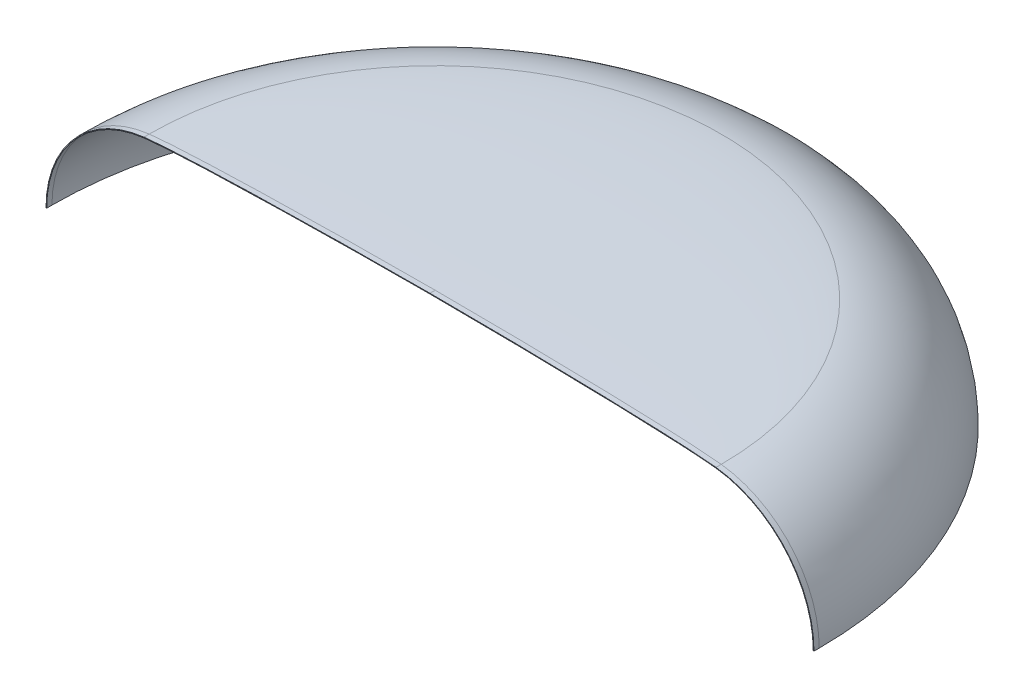
ISO-10303-21;
HEADER;
FILE_DESCRIPTION(('STEP AP214'),'2;1');
FILE_NAME('part.step','',(''),(''),'','','');
FILE_SCHEMA(('AUTOMOTIVE_DESIGN { 1 0 10303 214 1 1 1 1 }'));
ENDSEC;
DATA;
#1=APPLICATION_CONTEXT('core data for automotive mechanical design processes');
#2=APPLICATION_PROTOCOL_DEFINITION('international standard','automotive_design',2000,#1);
#3=PRODUCT_CONTEXT('',#1,'mechanical');
#4=PRODUCT('Part','Part','',(#3));
#5=PRODUCT_RELATED_PRODUCT_CATEGORY('part','',(#4));
#6=PRODUCT_DEFINITION_FORMATION('','',#4);
#7=PRODUCT_DEFINITION_CONTEXT('part definition',#1,'design');
#8=PRODUCT_DEFINITION('design','',#6,#7);
#9=PRODUCT_DEFINITION_SHAPE('','',#8);
#10=(LENGTH_UNIT() NAMED_UNIT(*) SI_UNIT(.MILLI.,.METRE.));
#11=(NAMED_UNIT(*) PLANE_ANGLE_UNIT() SI_UNIT($,.RADIAN.));
#12=(NAMED_UNIT(*) SI_UNIT($,.STERADIAN.) SOLID_ANGLE_UNIT());
#13=UNCERTAINTY_MEASURE_WITH_UNIT(LENGTH_MEASURE(1.E-05),#10,'distance_accuracy_value','');
#14=(GEOMETRIC_REPRESENTATION_CONTEXT(3) GLOBAL_UNCERTAINTY_ASSIGNED_CONTEXT((#13)) GLOBAL_UNIT_ASSIGNED_CONTEXT((#10,
#11,#12)) REPRESENTATION_CONTEXT('',''));
#15=CARTESIAN_POINT('',(0.,0.,0.));
#16=DIRECTION('',(0.,0.,1.));
#17=DIRECTION('',(1.,0.,0.));
#18=AXIS2_PLACEMENT_3D('',#15,#16,#17);
#19=CARTESIAN_POINT('',(1875.,2.22044604925031E-13,15.));
#20=DIRECTION('',(0.,0.,1.));
#21=DIRECTION('',(1.,0.,0.));
#22=AXIS2_PLACEMENT_3D('',#19,#20,#21);
#23=PLANE('',#22);
#24=CARTESIAN_POINT('',(1875.,2.22044604925031E-13,15.));
#25=DIRECTION('',(0.,0.,1.));
#26=DIRECTION('',(1.,0.,0.));
#27=AXIS2_PLACEMENT_3D('',#24,#25,#26);
#28=CIRCLE('',#27,317.);
#29=CARTESIAN_POINT('',(1912.14977581783,314.815651066914,15.));
#30=VERTEX_POINT('',#29);
#31=CARTESIAN_POINT('',(2192.,0.,15.));
#32=VERTEX_POINT('',#31);
#33=EDGE_CURVE('E217',#30,#32,#28,.F.);
#34=ORIENTED_EDGE('',*,*,#33,.F.);
#35=CARTESIAN_POINT('',(1094.99999999993,337.,15.));
#36=CARTESIAN_POINT('',(1103.96036074189,336.999940865988,15.));
#37=CARTESIAN_POINT('',(1112.92071732974,336.991174722904,15.));
#38=CARTESIAN_POINT('',(1131.08450625589,336.957165520921,15.));
#39=CARTESIAN_POINT('',(1140.28793778156,336.931481875451,15.));
#40=CARTESIAN_POINT('',(1168.51876355099,336.829088680172,15.));
#41=CARTESIAN_POINT('',(1187.54606906934,336.727176680853,15.));
#42=CARTESIAN_POINT('',(1226.24655488747,336.461354570261,15.));
#43=CARTESIAN_POINT('',(1245.91972116331,336.29545618794,15.));
#44=CARTESIAN_POINT('',(1285.69428721601,335.902850316178,15.));
#45=CARTESIAN_POINT('',(1305.79567464992,335.674896234636,15.));
#46=CARTESIAN_POINT('',(1346.20901865577,335.159545841188,15.));
#47=CARTESIAN_POINT('',(1366.52096756817,334.871549883643,15.));
#48=CARTESIAN_POINT('',(1407.13776543415,334.23753319576,15.));
#49=CARTESIAN_POINT('',(1427.44261466394,333.891530187172,15.));
#50=CARTESIAN_POINT('',(1467.82754366125,333.142923741981,15.));
#51=CARTESIAN_POINT('',(1487.90763572095,332.740985725727,15.));
#52=CARTESIAN_POINT('',(1527.62538660109,331.881870897273,15.));
#53=CARTESIAN_POINT('',(1547.26307571788,331.426101305493,15.));
#54=CARTESIAN_POINT('',(1585.8783742718,330.460579393613,15.));
#55=CARTESIAN_POINT('',(1604.85604132891,329.953149127699,15.));
#56=CARTESIAN_POINT('',(1641.93366417964,328.88528114114,15.));
#57=CARTESIAN_POINT('',(1660.03372089397,328.328368895835,15.));
#58=CARTESIAN_POINT('',(1695.13857544201,327.162397858668,15.));
#59=CARTESIAN_POINT('',(1712.14354222804,326.558515253001,15.));
#60=CARTESIAN_POINT('',(1737.17071899477,325.593772304584,15.));
#61=CARTESIAN_POINT('',(1745.19447539934,325.272977006854,15.));
#62=CARTESIAN_POINT('',(1760.8866305248,324.61899563473,15.));
#63=CARTESIAN_POINT('',(1768.55507784564,324.286981955501,15.));
#64=CARTESIAN_POINT('',(1783.50945703505,323.610632626518,15.));
#65=CARTESIAN_POINT('',(1790.79545342614,323.26773004809,15.));
#66=CARTESIAN_POINT('',(1804.95779283146,322.569546348784,15.));
#67=CARTESIAN_POINT('',(1811.83422255326,322.216034393121,15.));
#68=CARTESIAN_POINT('',(1825.15031896062,321.496498768584,15.));
#69=CARTESIAN_POINT('',(1831.59010405566,321.132680350907,15.));
#70=CARTESIAN_POINT('',(1844.00585218307,320.392288307087,15.));
#71=CARTESIAN_POINT('',(1849.98197966016,320.0184975128,15.));
#72=CARTESIAN_POINT('',(1861.4434101794,319.257683044466,15.));
#73=CARTESIAN_POINT('',(1866.92894862815,318.874231675883,15.));
#74=CARTESIAN_POINT('',(1877.38237841589,318.093535979092,15.));
#75=CARTESIAN_POINT('',(1882.35061120329,317.700950762681,15.));
#76=CARTESIAN_POINT('',(1889.5984418008,317.083168567908,15.));
#77=CARTESIAN_POINT('',(1891.88009886147,316.882162047771,15.));
#78=CARTESIAN_POINT('',(1896.30405955401,316.476802877601,15.));
#79=CARTESIAN_POINT('',(1898.44644869174,316.273387176007,15.));
#80=CARTESIAN_POINT('',(1902.58864131815,315.863209089901,15.));
#81=CARTESIAN_POINT('',(1904.58855277894,315.657547285882,15.));
#82=CARTESIAN_POINT('',(1908.44252188267,315.242277249429,15.));
#83=CARTESIAN_POINT('',(1910.29672519726,315.034016537193,15.));
#84=CARTESIAN_POINT('',(1912.14977581766,314.815651066934,15.));
#85=B_SPLINE_CURVE_WITH_KNOTS('',3,(#35,#36,#37,#38,#39,#40,#41,#42,#43,#44,#45,#46,#47,#48,#49,
#50,#51,#52,#53,#54,#55,#56,#57,#58,#59,#60,#61,#62,#63,#64,#65,#66,#67,#68,#69,#70,#71,#72,#73,
#74,#75,#76,#77,#78,#79,#80,#81,#82,#83,#84),.UNSPECIFIED.,.F.,.F.,(4,2,2,2,2,2,2,2,2,2,2,2,2,2,
2,2,2,2,2,2,2,2,2,2,4),(0.,26.8810713343365,54.4914598182382,111.574086056879,170.595599379253,
230.903555983013,291.845445909116,352.768751277024,413.020999705737,471.949823400539,
528.903035910177,583.228744798705,634.275533302954,658.365997508013,681.39284348261,
703.274967824619,723.931424198899,743.281490130217,761.244772486994,777.741381539813,
792.692233799899,799.563671491585,806.019691916278,812.050980804284,817.648515552536),.UNSPECIFIED.);
#86=CARTESIAN_POINT('',(1095.,337.,15.));
#87=VERTEX_POINT('',#86);
#88=EDGE_CURVE('E210',#87,#30,#85,.T.);
#89=ORIENTED_EDGE('',*,*,#88,.F.);
#90=CARTESIAN_POINT('',(277.850224182145,314.815651066911,15.));
#91=CARTESIAN_POINT('',(279.703274802572,315.034016537173,15.));
#92=CARTESIAN_POINT('',(281.557478117186,315.242277249414,15.));
#93=CARTESIAN_POINT('',(285.411447221049,315.657547285881,15.));
#94=CARTESIAN_POINT('',(287.411358681932,315.86320908991,15.));
#95=CARTESIAN_POINT('',(291.553551308407,316.273387176021,15.));
#96=CARTESIAN_POINT('',(293.695940446107,316.476802877613,15.));
#97=CARTESIAN_POINT('',(298.119901138646,316.882162047781,15.));
#98=CARTESIAN_POINT('',(300.401558199335,317.083168567919,15.));
#99=CARTESIAN_POINT('',(307.649388796852,317.700950762692,15.));
#100=CARTESIAN_POINT('',(312.617621584233,318.093535979101,15.));
#101=CARTESIAN_POINT('',(323.071051371911,318.874231675887,15.));
#102=CARTESIAN_POINT('',(328.556589820622,319.257683044467,15.));
#103=CARTESIAN_POINT('',(340.018020339821,320.018497512799,15.));
#104=CARTESIAN_POINT('',(345.994147816913,320.392288307086,15.));
#105=CARTESIAN_POINT('',(358.409895944336,321.132680350907,15.));
#106=CARTESIAN_POINT('',(364.849681039378,321.496498768584,15.));
#107=CARTESIAN_POINT('',(378.165777446746,322.216034393122,15.));
#108=CARTESIAN_POINT('',(385.042207168544,322.569546348784,15.));
#109=CARTESIAN_POINT('',(399.204546573841,323.267730048089,15.));
#110=CARTESIAN_POINT('',(406.490542964912,323.610632626516,15.));
#111=CARTESIAN_POINT('',(421.444922154291,324.286981955498,15.));
#112=CARTESIAN_POINT('',(429.113369475123,324.618995634727,15.));
#113=CARTESIAN_POINT('',(444.805524600588,325.272977006851,15.));
#114=CARTESIAN_POINT('',(452.829281005157,325.593772304581,15.));
#115=CARTESIAN_POINT('',(477.856457771824,326.558515252996,15.));
#116=CARTESIAN_POINT('',(494.86142455779,327.162397858661,15.));
#117=CARTESIAN_POINT('',(529.966279105794,328.328368895828,15.));
#118=CARTESIAN_POINT('',(548.066335820149,328.885281141133,15.));
#119=CARTESIAN_POINT('',(585.143958670924,329.953149127694,15.));
#120=CARTESIAN_POINT('',(604.121625728052,330.46057939361,15.));
#121=CARTESIAN_POINT('',(642.736924281977,331.426101305489,15.));
#122=CARTESIAN_POINT('',(662.374613398746,331.881870897269,15.));
#123=CARTESIAN_POINT('',(702.092364278891,332.740985725724,15.));
#124=CARTESIAN_POINT('',(722.172456338603,333.142923741978,15.));
#125=CARTESIAN_POINT('',(762.557385335953,333.891530187171,15.));
#126=CARTESIAN_POINT('',(782.862234565764,334.237533195759,15.));
#127=CARTESIAN_POINT('',(823.479032431789,334.871549883643,15.));
#128=CARTESIAN_POINT('',(843.790981344208,335.159545841187,15.));
#129=CARTESIAN_POINT('',(884.204325350095,335.674896234636,15.));
#130=CARTESIAN_POINT('',(904.305712784022,335.902850316178,15.));
#131=CARTESIAN_POINT('',(944.080278836749,336.29545618794,15.));
#132=CARTESIAN_POINT('',(963.753445112592,336.461354570262,15.));
#133=CARTESIAN_POINT('',(1002.45393093071,336.727176680853,15.));
#134=CARTESIAN_POINT('',(1021.48123644903,336.829088680172,15.));
#135=CARTESIAN_POINT('',(1049.71206221848,336.931481875451,15.));
#136=CARTESIAN_POINT('',(1058.91549374419,336.957165520922,15.));
#137=CARTESIAN_POINT('',(1077.07928267032,336.991174722904,15.));
#138=CARTESIAN_POINT('',(1086.03963925811,336.999940865988,15.));
#139=CARTESIAN_POINT('',(1095.,337.,15.));
#140=B_SPLINE_CURVE_WITH_KNOTS('',3,(#90,#91,#92,#93,#94,#95,#96,#97,#98,#99,#100,#101,#102,
#103,#104,#105,#106,#107,#108,#109,#110,#111,#112,#113,#114,#115,#116,#117,#118,#119,#120,#121,
#122,#123,#124,#125,#126,#127,#128,#129,#130,#131,#132,#133,#134,#135,#136,#137,#138,#139),
.UNSPECIFIED.,.F.,.F.,(4,2,2,2,2,2,2,2,2,2,2,2,2,2,2,2,2,2,2,2,2,2,2,2,4),(0.,5.59753474833848,
11.6288236366361,18.0848440612437,24.9562817529867,39.907134013032,56.4037430657143,
74.3670254225118,93.7170913538404,114.373547728119,136.255672070062,159.282518044642,
183.372982249707,234.419770753767,288.745479642371,345.698692152071,404.627515846816,
464.879764275588,525.803069643556,586.744959569719,647.052916173538,706.07442949592,
763.157055734499,790.767444218525,817.648515552669),.UNSPECIFIED.);
#141=CARTESIAN_POINT('',(277.850224182167,314.815651066914,15.));
#142=VERTEX_POINT('',#141);
#143=EDGE_CURVE('E219',#142,#87,#140,.T.);
#144=ORIENTED_EDGE('',*,*,#143,.F.);
#145=CARTESIAN_POINT('',(315.,2.22044604925031E-13,15.));
#146=DIRECTION('',(0.,0.,1.));
#147=DIRECTION('',(1.,0.,0.));
#148=AXIS2_PLACEMENT_3D('',#145,#146,#147);
#149=CIRCLE('',#148,317.);
#150=CARTESIAN_POINT('',(-2.,1.20089628935533E-13,15.));
#151=VERTEX_POINT('',#150);
#152=EDGE_CURVE('E126',#151,#142,#149,.F.);
#153=ORIENTED_EDGE('',*,*,#152,.F.);
#154=DIRECTION('',(-1.,0.,0.));
#155=VECTOR('',#154,1.);
#156=CARTESIAN_POINT('',(0.,0.,15.));
#157=LINE('',#156,#155);
#158=CARTESIAN_POINT('',(0.,0.,15.));
#159=VERTEX_POINT('',#158);
#160=EDGE_CURVE('E11',#159,#151,#157,.T.);
#161=ORIENTED_EDGE('',*,*,#160,.F.);
#162=CARTESIAN_POINT('',(315.,2.22044604925031E-13,15.));
#163=DIRECTION('',(0.,0.,-1.));
#164=DIRECTION('',(1.,0.,0.));
#165=AXIS2_PLACEMENT_3D('',#162,#163,#164);
#166=CIRCLE('',#165,315.);
#167=CARTESIAN_POINT('',(278.084607625813,312.829432448195,15.));
#168=VERTEX_POINT('',#167);
#169=EDGE_CURVE('E124',#159,#168,#166,.T.);
#170=ORIENTED_EDGE('',*,*,#169,.T.);
#171=CARTESIAN_POINT('',(278.084607625813,312.829432448195,15.));
#172=CARTESIAN_POINT('',(391.549286988278,326.21881568652,15.));
#173=CARTESIAN_POINT('',(812.489449679245,335.,15.));
#174=CARTESIAN_POINT('',(1095.,335.,15.));
#175=B_SPLINE_CURVE_WITH_KNOTS('',3,(#171,#172,#173,#174),.UNSPECIFIED.,.F.,.F.,(4,4),(0.,1.),.UNSPECIFIED.);
#176=CARTESIAN_POINT('',(1095.,335.,15.));
#177=VERTEX_POINT('',#176);
#178=EDGE_CURVE('E142',#168,#177,#175,.T.);
#179=ORIENTED_EDGE('',*,*,#178,.T.);
#180=CARTESIAN_POINT('',(1095.,335.,15.));
#181=CARTESIAN_POINT('',(1377.51055032075,335.,15.));
#182=CARTESIAN_POINT('',(1798.45071301172,326.21881568652,15.));
#183=CARTESIAN_POINT('',(1911.91539237419,312.829432448195,15.));
#184=B_SPLINE_CURVE_WITH_KNOTS('',3,(#180,#181,#182,#183),.UNSPECIFIED.,.F.,.F.,(4,4),(0.,1.),.UNSPECIFIED.);
#185=CARTESIAN_POINT('',(1911.91539237419,312.829432448195,15.));
#186=VERTEX_POINT('',#185);
#187=EDGE_CURVE('E149',#177,#186,#184,.T.);
#188=ORIENTED_EDGE('',*,*,#187,.T.);
#189=CARTESIAN_POINT('',(1875.,2.22044604925031E-13,15.));
#190=DIRECTION('',(0.,0.,-1.));
#191=DIRECTION('',(1.,0.,0.));
#192=AXIS2_PLACEMENT_3D('',#189,#190,#191);
#193=CIRCLE('',#192,315.);
#194=CARTESIAN_POINT('',(2190.,0.,15.));
#195=VERTEX_POINT('',#194);
#196=EDGE_CURVE('E153',#186,#195,#193,.T.);
#197=ORIENTED_EDGE('',*,*,#196,.T.);
#198=DIRECTION('',(1.,0.,0.));
#199=VECTOR('',#198,1.);
#200=CARTESIAN_POINT('',(2190.,0.,15.));
#201=LINE('',#200,#199);
#202=EDGE_CURVE('E53',#195,#32,#201,.T.);
#203=ORIENTED_EDGE('',*,*,#202,.T.);
#204=EDGE_LOOP('',(#34,#89,#144,#153,#161,#170,#179,#188,#197,#203));
#205=FACE_BOUND('',#204,.T.);
#206=ADVANCED_FACE('F43',(#205),#23,.T.);
#207=CARTESIAN_POINT('',(0.,0.,7.5));
#208=DIRECTION('',(0.,-1.,0.));
#209=DIRECTION('',(0.,0.,1.));
#210=AXIS2_PLACEMENT_3D('',#207,#208,#209);
#211=PLANE('',#210);
#212=DIRECTION('',(0.,0.,1.));
#213=VECTOR('',#212,1.);
#214=CARTESIAN_POINT('',(0.,0.,0.));
#215=LINE('',#214,#213);
#216=CARTESIAN_POINT('',(0.,0.,0.));
#217=VERTEX_POINT('',#216);
#218=EDGE_CURVE('E132',#217,#159,#215,.T.);
#219=ORIENTED_EDGE('',*,*,#218,.T.);
#220=ORIENTED_EDGE('',*,*,#160,.T.);
#221=DIRECTION('',(0.,0.,1.));
#222=VECTOR('',#221,1.);
#223=CARTESIAN_POINT('',(-2.,1.20089628935533E-13,0.));
#224=LINE('',#223,#222);
#225=CARTESIAN_POINT('',(-2.,0.,0.));
#226=VERTEX_POINT('',#225);
#227=EDGE_CURVE('E316',#226,#151,#224,.T.);
#228=ORIENTED_EDGE('',*,*,#227,.F.);
#229=CARTESIAN_POINT('',(1095.,0.,0.));
#230=DIRECTION('',(0.,-1.,0.));
#231=DIRECTION('',(0.,0.,-1.));
#232=AXIS2_PLACEMENT_3D('',#229,#230,#231);
#233=CIRCLE('',#232,1097.);
#234=CARTESIAN_POINT('',(2192.,-1.3715056118585E-13,3.82317206603323E-12));
#235=VERTEX_POINT('',#234);
#236=EDGE_CURVE('E164',#226,#235,#233,.T.);
#237=ORIENTED_EDGE('',*,*,#236,.T.);
#238=DIRECTION('',(0.,0.,1.));
#239=VECTOR('',#238,1.);
#240=CARTESIAN_POINT('',(2192.,0.,0.));
#241=LINE('',#240,#239);
#242=EDGE_CURVE('E185',#235,#32,#241,.T.);
#243=ORIENTED_EDGE('',*,*,#242,.T.);
#244=ORIENTED_EDGE('',*,*,#202,.F.);
#245=DIRECTION('',(0.,0.,1.));
#246=VECTOR('',#245,1.);
#247=CARTESIAN_POINT('',(2190.,0.,0.));
#248=LINE('',#247,#246);
#249=CARTESIAN_POINT('',(2190.,0.,3.82317206603323E-12));
#250=VERTEX_POINT('',#249);
#251=EDGE_CURVE('E154',#250,#195,#248,.T.);
#252=ORIENTED_EDGE('',*,*,#251,.F.);
#253=CARTESIAN_POINT('',(1095.,0.,0.));
#254=DIRECTION('',(0.,-1.,0.));
#255=DIRECTION('',(0.,0.,-1.));
#256=AXIS2_PLACEMENT_3D('',#253,#254,#255);
#257=CIRCLE('',#256,1095.);
#258=EDGE_CURVE('E138',#217,#250,#257,.T.);
#259=ORIENTED_EDGE('',*,*,#258,.F.);
#260=EDGE_LOOP('',(#219,#220,#228,#237,#243,#244,#252,#259));
#261=FACE_BOUND('',#260,.T.);
#262=ADVANCED_FACE('F45',(#261),#211,.T.);
#263=CARTESIAN_POINT('',(1095.,2.22044604925031E-13,0.));
#264=DIRECTION('',(0.,-1.,0.));
#265=DIRECTION('',(0.,0.,-1.));
#266=AXIS2_PLACEMENT_3D('',#263,#264,#265);
#267=TOROIDAL_SURFACE('',#266,780.,317.);
#268=CARTESIAN_POINT('',(1875.,2.22044604925031E-13,3.82317206603323E-12));
#269=DIRECTION('',(0.,0.,1.));
#270=DIRECTION('',(1.,0.,0.));
#271=AXIS2_PLACEMENT_3D('',#268,#269,#270);
#272=CIRCLE('',#271,317.);
#273=CARTESIAN_POINT('',(1912.14977581783,314.815651066914,2.85224484788819E-12));
#274=VERTEX_POINT('',#273);
#275=EDGE_CURVE('E172',#235,#274,#272,.T.);
#276=ORIENTED_EDGE('',*,*,#275,.F.);
#277=ORIENTED_EDGE('',*,*,#236,.F.);
#278=CARTESIAN_POINT('',(315.,2.22044604925031E-13,1.4328367550024E-13));
#279=DIRECTION('',(0.,0.,1.));
#280=DIRECTION('',(1.,0.,0.));
#281=AXIS2_PLACEMENT_3D('',#278,#279,#280);
#282=CIRCLE('',#281,317.);
#283=CARTESIAN_POINT('',(277.850224182167,314.815651066914,0.));
#284=VERTEX_POINT('',#283);
#285=EDGE_CURVE('E159',#226,#284,#282,.F.);
#286=ORIENTED_EDGE('',*,*,#285,.T.);
#287=CARTESIAN_POINT('',(1095.,314.815651066914,0.));
#288=DIRECTION('',(0.,-1.,0.));
#289=DIRECTION('',(0.,0.,-1.));
#290=AXIS2_PLACEMENT_3D('',#287,#288,#289);
#291=CIRCLE('',#290,817.149775817833);
#292=EDGE_CURVE('E177',#284,#274,#291,.T.);
#293=ORIENTED_EDGE('',*,*,#292,.T.);
#294=EDGE_LOOP('',(#276,#277,#286,#293));
#295=FACE_BOUND('',#294,.T.);
#296=ADVANCED_FACE('F240',(#295),#267,.T.);
#297=CARTESIAN_POINT('',(278.084607625813,312.829432448195,0.));
#298=CARTESIAN_POINT('',(391.549286988278,326.21881568652,0.));
#299=CARTESIAN_POINT('',(812.489449679245,335.,0.));
#300=CARTESIAN_POINT('',(1095.,335.,0.));
#301=B_SPLINE_CURVE_WITH_KNOTS('',3,(#297,#298,#299,#300),.UNSPECIFIED.,.F.,.F.,(4,4),(0.,1.),.UNSPECIFIED.);
#302=CARTESIAN_POINT('',(1095.,335.,0.));
#303=DIRECTION('',(0.,-1.,0.));
#304=AXIS1_PLACEMENT('',#302,#303);
#305=SURFACE_OF_REVOLUTION('',#301,#304);
#306=OFFSET_SURFACE('',#305,-2.,.F.);
#307=CARTESIAN_POINT('',(1094.99999999993,337.,1.65009978329497E-12));
#308=CARTESIAN_POINT('',(1103.96036074189,336.999940865988,1.65009978329497E-12));
#309=CARTESIAN_POINT('',(1112.92071732974,336.991174722904,1.65009978329497E-12));
#310=CARTESIAN_POINT('',(1131.08450625589,336.957165520921,1.65009978329497E-12));
#311=CARTESIAN_POINT('',(1140.28793778156,336.931481875451,1.65009978329497E-12));
#312=CARTESIAN_POINT('',(1168.51876355099,336.829088680172,1.65009978329497E-12));
#313=CARTESIAN_POINT('',(1187.54606906934,336.727176680853,1.65009978329497E-12));
#314=CARTESIAN_POINT('',(1226.24655488747,336.461354570261,1.65009978329497E-12));
#315=CARTESIAN_POINT('',(1245.91972116331,336.29545618794,1.65009978329497E-12));
#316=CARTESIAN_POINT('',(1285.69428721601,335.902850316178,1.65009978329497E-12));
#317=CARTESIAN_POINT('',(1305.79567464992,335.674896234636,1.65009978329497E-12));
#318=CARTESIAN_POINT('',(1346.20901865577,335.159545841188,1.65009978329497E-12));
#319=CARTESIAN_POINT('',(1366.52096756817,334.871549883643,1.65009978329497E-12));
#320=CARTESIAN_POINT('',(1407.13776543415,334.23753319576,1.65009978329497E-12));
#321=CARTESIAN_POINT('',(1427.44261466394,333.891530187172,1.65009978329497E-12));
#322=CARTESIAN_POINT('',(1467.82754366125,333.142923741981,1.65009978329497E-12));
#323=CARTESIAN_POINT('',(1487.90763572095,332.740985725727,1.65009978329497E-12));
#324=CARTESIAN_POINT('',(1527.62538660109,331.881870897273,1.65009978329497E-12));
#325=CARTESIAN_POINT('',(1547.26307571788,331.426101305493,1.65009978329497E-12));
#326=CARTESIAN_POINT('',(1585.8783742718,330.460579393613,1.65009978329497E-12));
#327=CARTESIAN_POINT('',(1604.85604132891,329.953149127699,1.65009978329497E-12));
#328=CARTESIAN_POINT('',(1641.93366417964,328.88528114114,1.65009978329497E-12));
#329=CARTESIAN_POINT('',(1660.03372089397,328.328368895835,1.65009978329497E-12));
#330=CARTESIAN_POINT('',(1695.13857544201,327.162397858668,1.65009978329497E-12));
#331=CARTESIAN_POINT('',(1712.14354222804,326.558515253001,1.65009978329497E-12));
#332=CARTESIAN_POINT('',(1737.17071899477,325.593772304584,1.65009978329497E-12));
#333=CARTESIAN_POINT('',(1745.19447539934,325.272977006854,1.65009978329497E-12));
#334=CARTESIAN_POINT('',(1760.8866305248,324.61899563473,1.65009978329497E-12));
#335=CARTESIAN_POINT('',(1768.55507784564,324.286981955501,1.65009978329497E-12));
#336=CARTESIAN_POINT('',(1783.50945703505,323.610632626518,1.65009978329497E-12));
#337=CARTESIAN_POINT('',(1790.79545342614,323.26773004809,1.65009978329497E-12));
#338=CARTESIAN_POINT('',(1804.95779283146,322.569546348784,1.65009978329497E-12));
#339=CARTESIAN_POINT('',(1811.83422255326,322.216034393121,1.65009978329497E-12));
#340=CARTESIAN_POINT('',(1825.15031896062,321.496498768584,1.65009978329497E-12));
#341=CARTESIAN_POINT('',(1831.59010405566,321.132680350907,1.65009978329497E-12));
#342=CARTESIAN_POINT('',(1844.00585218307,320.392288307087,1.65009978329497E-12));
#343=CARTESIAN_POINT('',(1849.98197966016,320.0184975128,1.65009978329497E-12));
#344=CARTESIAN_POINT('',(1861.4434101794,319.257683044466,1.65009978329497E-12));
#345=CARTESIAN_POINT('',(1866.92894862815,318.874231675883,1.65009978329497E-12));
#346=CARTESIAN_POINT('',(1877.38237841589,318.093535979092,1.65009978329497E-12));
#347=CARTESIAN_POINT('',(1882.35061120329,317.700950762681,1.65009978329497E-12));
#348=CARTESIAN_POINT('',(1889.5984418008,317.083168567908,1.65009978329497E-12));
#349=CARTESIAN_POINT('',(1891.88009886147,316.882162047771,1.65009978329497E-12));
#350=CARTESIAN_POINT('',(1896.30405955401,316.476802877601,1.65009978329497E-12));
#351=CARTESIAN_POINT('',(1898.44644869174,316.273387176007,1.65009978329497E-12));
#352=CARTESIAN_POINT('',(1902.58864131815,315.863209089901,1.65009978329497E-12));
#353=CARTESIAN_POINT('',(1904.58855277894,315.657547285882,1.65009978329497E-12));
#354=CARTESIAN_POINT('',(1908.44252188267,315.242277249429,1.65009978329497E-12));
#355=CARTESIAN_POINT('',(1910.29672519726,315.034016537193,1.65009978329497E-12));
#356=CARTESIAN_POINT('',(1912.14977581766,314.815651066934,1.65009978329497E-12));
#357=B_SPLINE_CURVE_WITH_KNOTS('',3,(#307,#308,#309,#310,#311,#312,#313,#314,#315,#316,#317,
#318,#319,#320,#321,#322,#323,#324,#325,#326,#327,#328,#329,#330,#331,#332,#333,#334,#335,#336,
#337,#338,#339,#340,#341,#342,#343,#344,#345,#346,#347,#348,#349,#350,#351,#352,#353,#354,#355,
#356),.UNSPECIFIED.,.F.,.F.,(4,2,2,2,2,2,2,2,2,2,2,2,2,2,2,2,2,2,2,2,2,2,2,2,4),(0.,
26.8810713343365,54.4914598182382,111.574086056879,170.595599379253,230.903555983013,
291.845445909116,352.768751277024,413.020999705737,471.949823400539,528.903035910177,
583.228744798705,634.275533302954,658.365997508013,681.39284348261,703.274967824619,
723.931424198899,743.281490130217,761.244772486994,777.741381539813,792.692233799899,
799.563671491585,806.019691916278,812.050980804284,817.648515552536),.UNSPECIFIED.);
#358=CARTESIAN_POINT('',(1095.,337.,0.));
#359=VERTEX_POINT('',#358);
#360=EDGE_CURVE('E61',#274,#359,#357,.F.);
#361=ORIENTED_EDGE('',*,*,#360,.F.);
#362=ORIENTED_EDGE('',*,*,#292,.F.);
#363=CARTESIAN_POINT('',(277.850224182145,314.815651066911,0.));
#364=CARTESIAN_POINT('',(279.703274802567,315.034016537173,0.));
#365=CARTESIAN_POINT('',(281.557478117175,315.242277249412,0.));
#366=CARTESIAN_POINT('',(285.411447221034,315.65754728588,0.));
#367=CARTESIAN_POINT('',(287.411358681917,315.863209089909,0.));
#368=CARTESIAN_POINT('',(291.553551308402,316.273387176021,0.));
#369=CARTESIAN_POINT('',(293.69594044611,316.476802877613,0.));
#370=CARTESIAN_POINT('',(298.119901138657,316.882162047782,0.));
#371=CARTESIAN_POINT('',(300.401558199345,317.08316856792,0.));
#372=CARTESIAN_POINT('',(307.649388796859,317.700950762693,0.));
#373=CARTESIAN_POINT('',(312.617621584237,318.0935359791,0.));
#374=CARTESIAN_POINT('',(323.071051371911,318.874231675888,0.));
#375=CARTESIAN_POINT('',(328.556589820623,319.257683044472,0.));
#376=CARTESIAN_POINT('',(340.018020339818,320.018497512793,0.));
#377=CARTESIAN_POINT('',(345.994147816906,320.392288307066,0.));
#378=CARTESIAN_POINT('',(358.409895944335,321.132680350928,0.));
#379=CARTESIAN_POINT('',(364.849681039389,321.496498768667,0.));
#380=CARTESIAN_POINT('',(378.165777446725,322.216034393033,0.));
#381=CARTESIAN_POINT('',(385.042207168474,322.569546348443,0.));
#382=CARTESIAN_POINT('',(399.204546573907,323.26773004845,0.));
#383=CARTESIAN_POINT('',(406.490542965177,323.610632627904,0.));
#384=CARTESIAN_POINT('',(421.444922154011,324.286981954038,0.));
#385=CARTESIAN_POINT('',(429.113369474049,324.618995629132,0.));
#386=CARTESIAN_POINT('',(444.80552460171,325.272977012704,0.));
#387=CARTESIAN_POINT('',(452.829281009446,325.593772326935,0.));
#388=CARTESIAN_POINT('',(477.85645776273,326.558515205629,0.));
#389=CARTESIAN_POINT('',(494.861424506119,327.162397589466,0.));
#390=CARTESIAN_POINT('',(529.966279160782,328.328369182314,0.));
#391=CARTESIAN_POINT('',(548.066336036871,328.885282270235,0.));
#392=CARTESIAN_POINT('',(585.14395844372,329.953147943982,0.));
#393=CARTESIAN_POINT('',(604.121624857697,330.46057485913,0.));
#394=CARTESIAN_POINT('',(642.736925182523,331.426105997262,0.));
#395=CARTESIAN_POINT('',(662.374616820168,331.881888722603,0.));
#396=CARTESIAN_POINT('',(692.011125174369,332.522914441249,0.));
#397=CARTESIAN_POINT('',(702.009452162187,332.731132022248,0.));
#398=CARTESIAN_POINT('',(722.08950380603,333.133872922819,0.));
#399=CARTESIAN_POINT('',(732.171231040583,333.328268062182,0.));
#400=CARTESIAN_POINT('',(752.390875528097,333.703076602738,0.));
#401=CARTESIAN_POINT('',(762.52879432603,333.883406484902,0.));
#402=CARTESIAN_POINT('',(782.833615782509,334.229783418733,0.));
#403=CARTESIAN_POINT('',(793.000519156079,334.395788543467,0.));
#404=CARTESIAN_POINT('',(813.336102436974,334.713222022549,0.));
#405=CARTESIAN_POINT('',(823.504782379008,334.864648152631,0.));
#406=CARTESIAN_POINT('',(843.816711135779,335.152629441808,0.));
#407=CARTESIAN_POINT('',(853.959959432915,335.289221129893,0.));
#408=CARTESIAN_POINT('',(874.193817746027,335.547241762564,0.));
#409=CARTESIAN_POINT('',(884.284426799854,335.668745965841,0.));
#410=CARTESIAN_POINT('',(899.392158205981,335.839765425128,0.));
#411=CARTESIAN_POINT('',(904.409219076511,335.894759256201,0.));
#412=CARTESIAN_POINT('',(914.419978285036,336.000857119147,0.));
#413=CARTESIAN_POINT('',(919.413676442924,336.05197809783,0.));
#414=CARTESIAN_POINT('',(929.374309188139,336.150296401889,0.));
#415=CARTESIAN_POINT('',(934.341243582221,336.197513311908,0.));
#416=CARTESIAN_POINT('',(944.244947964251,336.287988805423,0.));
#417=CARTESIAN_POINT('',(949.181717748161,336.331269709426,0.));
#418=CARTESIAN_POINT('',(959.021692087945,336.413838617479,0.));
#419=CARTESIAN_POINT('',(963.924896432483,336.453151790038,0.));
#420=CARTESIAN_POINT('',(973.694339115789,336.527750442687,0.));
#421=CARTESIAN_POINT('',(978.560577239561,336.563064073612,0.));
#422=CARTESIAN_POINT('',(988.252686868741,336.629628873067,0.));
#423=CARTESIAN_POINT('',(993.078558158558,336.660911329289,0.));
#424=CARTESIAN_POINT('',(1000.30117334411,336.704862749809,0.));
#425=CARTESIAN_POINT('',(1002.6979085318,336.718974940816,0.));
#426=CARTESIAN_POINT('',(1007.48001200085,336.746174597581,0.));
#427=CARTESIAN_POINT('',(1009.86538025628,336.759266607873,0.));
#428=CARTESIAN_POINT('',(1014.62432478257,336.784421756109,0.));
#429=CARTESIAN_POINT('',(1016.99790102823,336.796489662228,0.));
#430=CARTESIAN_POINT('',(1021.73283648584,336.81959237769,0.));
#431=CARTESIAN_POINT('',(1024.09419567339,336.830632186589,0.));
#432=CARTESIAN_POINT('',(1028.8042719672,336.851674493556,0.));
#433=CARTESIAN_POINT('',(1031.15298905005,336.861682230381,0.));
#434=CARTESIAN_POINT('',(1035.83735609751,336.880656166677,0.));
#435=CARTESIAN_POINT('',(1038.17300603989,336.889627852571,0.));
#436=CARTESIAN_POINT('',(1042.83081377392,336.906525449043,0.));
#437=CARTESIAN_POINT('',(1045.15297154475,336.914457102739,0.));
#438=CARTESIAN_POINT('',(1049.78336992697,336.929270400355,0.));
#439=CARTESIAN_POINT('',(1052.09161051906,336.936158053627,0.));
#440=CARTESIAN_POINT('',(1055.54862066095,336.945713747819,0.));
#441=CARTESIAN_POINT('',(1056.69738916699,336.948763457354,0.));
#442=CARTESIAN_POINT('',(1058.99128750859,336.954599541766,0.));
#443=CARTESIAN_POINT('',(1060.1364173421,336.957386720285,0.));
#444=CARTESIAN_POINT('',(1062.42298521151,336.962697231538,0.));
#445=CARTESIAN_POINT('',(1063.56442324551,336.965221386047,0.));
#446=CARTESIAN_POINT('',(1065.84355439306,336.970005331505,0.));
#447=CARTESIAN_POINT('',(1066.98124750483,336.972265962746,0.));
#448=CARTESIAN_POINT('',(1069.25283568434,336.976522344914,0.));
#449=CARTESIAN_POINT('',(1070.38673075046,336.978518955023,0.));
#450=CARTESIAN_POINT('',(1072.6506697181,336.98224677827,0.));
#451=CARTESIAN_POINT('',(1073.78071361816,336.983978869866,0.));
#452=CARTESIAN_POINT('',(1075.47431881305,336.986379649478,0.));
#453=CARTESIAN_POINT('',(1076.03787997079,336.987146149006,0.));
#454=CARTESIAN_POINT('',(1077.16401957449,336.988612715432,0.));
#455=CARTESIAN_POINT('',(1077.7265980203,336.989312895851,0.));
#456=CARTESIAN_POINT('',(1078.85076555978,336.990646760878,0.));
#457=CARTESIAN_POINT('',(1079.41235465332,336.991280560269,0.));
#458=CARTESIAN_POINT('',(1080.53453684828,336.992481599575,0.));
#459=CARTESIAN_POINT('',(1081.09512994957,336.99304895555,0.));
#460=CARTESIAN_POINT('',(1082.21531352023,336.994117044476,0.));
#461=CARTESIAN_POINT('',(1082.77490398947,336.994617894775,0.));
#462=CARTESIAN_POINT('',(1083.89307565605,336.995552908731,0.));
#463=CARTESIAN_POINT('',(1084.45165685328,336.99598719104,0.));
#464=CARTESIAN_POINT('',(1085.56780333632,336.996789005455,0.));
#465=CARTESIAN_POINT('',(1086.12536862205,336.997156657531,0.));
#466=CARTESIAN_POINT('',(1086.96133352293,336.997658255468,0.));
#467=CARTESIAN_POINT('',(1087.23973312339,336.997817049221,0.));
#468=CARTESIAN_POINT('',(1087.79627585659,336.998117940377,0.));
#469=CARTESIAN_POINT('',(1088.07441898932,336.998260053027,0.));
#470=CARTESIAN_POINT('',(1088.63044795695,336.998527574137,0.));
#471=CARTESIAN_POINT('',(1088.90833379185,336.998652997928,0.));
#472=CARTESIAN_POINT('',(1089.4638473339,336.998887133414,0.));
#473=CARTESIAN_POINT('',(1089.74147504104,336.998995860524,0.));
#474=CARTESIAN_POINT('',(1090.29647149776,336.999196594874,0.));
#475=CARTESIAN_POINT('',(1090.57384024733,336.999288617615,0.));
#476=CARTESIAN_POINT('',(1091.12831795859,336.999455934983,0.));
#477=CARTESIAN_POINT('',(1091.40542692026,336.999531245197,0.));
#478=CARTESIAN_POINT('',(1091.82099268526,336.999631683191,0.));
#479=CARTESIAN_POINT('',(1091.9594494867,336.999663065768,0.));
#480=CARTESIAN_POINT('',(1092.23629782999,336.99972164647,0.));
#481=CARTESIAN_POINT('',(1092.37468937184,336.999748846562,0.));
#482=CARTESIAN_POINT('',(1092.65140709926,336.999799068514,0.));
#483=CARTESIAN_POINT('',(1092.78973328483,336.999822092343,0.));
#484=CARTESIAN_POINT('',(1093.06632016953,336.999863933784,0.));
#485=CARTESIAN_POINT('',(1093.20458086867,336.999882753382,0.));
#486=CARTESIAN_POINT('',(1093.48103677504,336.999916286144,0.));
#487=CARTESIAN_POINT('',(1093.61923198225,336.999931001251,0.));
#488=CARTESIAN_POINT('',(1093.82649995569,336.999949713734,0.));
#489=CARTESIAN_POINT('',(1093.89557283013,336.999955390485,0.));
#490=CARTESIAN_POINT('',(1094.03370254208,336.999966102033,0.));
#491=CARTESIAN_POINT('',(1094.10275937951,336.999971136981,0.));
#492=CARTESIAN_POINT('',(1094.24085510539,336.999978616208,0.));
#493=CARTESIAN_POINT('',(1094.3098939942,336.999981061103,0.));
#494=CARTESIAN_POINT('',(1094.44796093737,336.999990673325,0.));
#495=CARTESIAN_POINT('',(1094.51698899038,336.999997839527,0.));
#496=CARTESIAN_POINT('',(1094.65500764707,336.999989599003,0.));
#497=CARTESIAN_POINT('',(1094.72399825574,336.999974197664,0.));
#498=CARTESIAN_POINT('',(1094.82753669152,337.000010543446,0.));
#499=CARTESIAN_POINT('',(1094.86205516253,337.000032562038,0.));
#500=CARTESIAN_POINT('',(1096.22904784906,336.998725476006,0.));
#501=CARTESIAN_POINT('',(1097.4816770592,336.915275040433,0.));
#502=CARTESIAN_POINT('',(1095.,333.,0.));
#503=B_SPLINE_CURVE_WITH_KNOTS('',3,(#363,#364,#365,#366,#367,#368,#369,#370,#371,#372,#373,
#374,#375,#376,#377,#378,#379,#380,#381,#382,#383,#384,#385,#386,#387,#388,#389,#390,#391,#392,
#393,#394,#395,#396,#397,#398,#399,#400,#401,#402,#403,#404,#405,#406,#407,#408,#409,#410,#411,
#412,#413,#414,#415,#416,#417,#418,#419,#420,#421,#422,#423,#424,#425,#426,#427,#428,#429,#430,
#431,#432,#433,#434,#435,#436,#437,#438,#439,#440,#441,#442,#443,#444,#445,#446,#447,#448,#449,
#450,#451,#452,#453,#454,#455,#456,#457,#458,#459,#460,#461,#462,#463,#464,#465,#466,#467,#468,
#469,#470,#471,#472,#473,#474,#475,#476,#477,#478,#479,#480,#481,#482,#483,#484,#485,#486,#487,
#488,#489,#490,#491,#492,#493,#494,#495,#496,#497,#498,#499,#500,#501,#502),.UNSPECIFIED.,.F.,
.F.,(4,2,2,2,2,2,2,2,2,2,2,2,2,2,2,2,2,2,2,2,2,2,2,2,2,2,2,2,2,2,2,2,2,2,2,2,2,2,2,2,2,2,2,2,2,
2,2,2,2,2,2,2,2,2,2,2,2,2,2,2,2,2,2,2,2,2,2,2,2,4),(0.,5.59753474832251,11.6288236366223,
18.0848440612555,24.9562817529972,39.907134013032,56.4037430657143,74.3670254225063,
93.7170913538356,114.373547728115,136.255672070062,159.282518044642,183.372982249705,
234.419770753767,288.745479642371,345.698692152071,404.627515846816,434.628990991987,
464.879782246951,495.298338917705,525.803103888596,556.312515512505,586.74500933511,
617.019019734097,632.071105453035,647.052983520384,661.954458645645,676.765335787643,
691.475420218386,706.074517589275,720.552434006968,727.742764052502,734.898976399417,
742.019796976666,749.103951757988,756.150166766175,763.157168075969,770.123681818218,
777.048434183868,780.494751823377,783.930151470194,787.354473916888,790.767559960972,
794.169250404433,797.559386054524,799.250071088436,800.937807729078,802.622576078886,
804.304356240242,805.983128316528,807.658872410897,809.33156862745,810.166767564282,
811.001197070874,811.834854659979,812.667737844827,813.499844138672,814.331171054533,
814.7465414686,815.161716105614,815.576694654854,815.991476805147,816.406062245907,
816.613281103211,816.820450666434,817.027570896786,817.234641755413,817.441663203589,
817.545155386511,821.546493279204),.UNSPECIFIED.);
#504=EDGE_CURVE('E180',#284,#359,#503,.T.);
#505=ORIENTED_EDGE('',*,*,#504,.T.);
#506=EDGE_LOOP('',(#361,#362,#505));
#507=FACE_BOUND('',#506,.T.);
#508=ADVANCED_FACE('F204',(#507),#306,.F.);
#509=CARTESIAN_POINT('',(1875.,2.22044604925031E-13,0.));
#510=DIRECTION('',(0.,0.,1.));
#511=DIRECTION('',(1.,0.,0.));
#512=AXIS2_PLACEMENT_3D('',#509,#510,#511);
#513=CYLINDRICAL_SURFACE('',#512,317.);
#514=ORIENTED_EDGE('',*,*,#33,.T.);
#515=ORIENTED_EDGE('',*,*,#242,.F.);
#516=ORIENTED_EDGE('',*,*,#275,.T.);
#517=DIRECTION('',(0.,0.,1.));
#518=VECTOR('',#517,1.);
#519=CARTESIAN_POINT('',(1912.14977581783,314.815651066914,0.));
#520=LINE('',#519,#518);
#521=EDGE_CURVE('E215',#274,#30,#520,.T.);
#522=ORIENTED_EDGE('',*,*,#521,.T.);
#523=EDGE_LOOP('',(#514,#515,#516,#522));
#524=FACE_BOUND('',#523,.T.);
#525=ADVANCED_FACE('F199',(#524),#513,.T.);
#526=CARTESIAN_POINT('',(1095.,335.,0.));
#527=CARTESIAN_POINT('',(1377.51055032075,335.,0.));
#528=CARTESIAN_POINT('',(1798.45071301172,326.21881568652,0.));
#529=CARTESIAN_POINT('',(1911.91539237419,312.829432448195,0.));
#530=B_SPLINE_CURVE_WITH_KNOTS('',3,(#526,#527,#528,#529),.UNSPECIFIED.,.F.,.F.,(4,4),(0.,1.),.UNSPECIFIED.);
#531=DIRECTION('',(0.,0.,1.));
#532=VECTOR('',#531,1.);
#533=SURFACE_OF_LINEAR_EXTRUSION('',#530,#532);
#534=OFFSET_SURFACE('',#533,-2.,.F.);
#535=ORIENTED_EDGE('',*,*,#88,.T.);
#536=ORIENTED_EDGE('',*,*,#521,.F.);
#537=ORIENTED_EDGE('',*,*,#360,.T.);
#538=DIRECTION('',(0.,0.,1.));
#539=VECTOR('',#538,1.);
#540=CARTESIAN_POINT('',(1095.,337.,0.));
#541=LINE('',#540,#539);
#542=EDGE_CURVE('E216',#359,#87,#541,.T.);
#543=ORIENTED_EDGE('',*,*,#542,.T.);
#544=EDGE_LOOP('',(#535,#536,#537,#543));
#545=FACE_BOUND('',#544,.T.);
#546=ADVANCED_FACE('F189',(#545),#534,.F.);
#547=CARTESIAN_POINT('',(278.084607625813,312.829432448195,0.));
#548=CARTESIAN_POINT('',(391.549286988278,326.21881568652,0.));
#549=CARTESIAN_POINT('',(812.489449679245,335.,0.));
#550=CARTESIAN_POINT('',(1095.,335.,0.));
#551=B_SPLINE_CURVE_WITH_KNOTS('',3,(#547,#548,#549,#550),.UNSPECIFIED.,.F.,.F.,(4,4),(0.,1.),.UNSPECIFIED.);
#552=DIRECTION('',(0.,0.,1.));
#553=VECTOR('',#552,1.);
#554=SURFACE_OF_LINEAR_EXTRUSION('',#551,#553);
#555=OFFSET_SURFACE('',#554,-2.,.F.);
#556=ORIENTED_EDGE('',*,*,#143,.T.);
#557=ORIENTED_EDGE('',*,*,#542,.F.);
#558=ORIENTED_EDGE('',*,*,#504,.F.);
#559=DIRECTION('',(0.,0.,1.));
#560=VECTOR('',#559,1.);
#561=CARTESIAN_POINT('',(277.850224182167,314.815651066914,0.));
#562=LINE('',#561,#560);
#563=EDGE_CURVE('E228',#284,#142,#562,.T.);
#564=ORIENTED_EDGE('',*,*,#563,.T.);
#565=EDGE_LOOP('',(#556,#557,#558,#564));
#566=FACE_BOUND('',#565,.T.);
#567=ADVANCED_FACE('F198',(#566),#555,.F.);
#568=CARTESIAN_POINT('',(315.,2.22044604925031E-13,0.));
#569=DIRECTION('',(0.,0.,1.));
#570=DIRECTION('',(1.,0.,0.));
#571=AXIS2_PLACEMENT_3D('',#568,#569,#570);
#572=CYLINDRICAL_SURFACE('',#571,317.);
#573=ORIENTED_EDGE('',*,*,#152,.T.);
#574=ORIENTED_EDGE('',*,*,#563,.F.);
#575=ORIENTED_EDGE('',*,*,#285,.F.);
#576=ORIENTED_EDGE('',*,*,#227,.T.);
#577=EDGE_LOOP('',(#573,#574,#575,#576));
#578=FACE_BOUND('',#577,.T.);
#579=ADVANCED_FACE('F238',(#578),#572,.T.);
#580=CARTESIAN_POINT('',(1095.,2.22044604925031E-13,0.));
#581=DIRECTION('',(0.,-1.,0.));
#582=DIRECTION('',(0.,0.,-1.));
#583=AXIS2_PLACEMENT_3D('',#580,#581,#582);
#584=TOROIDAL_SURFACE('',#583,780.,315.);
#585=CARTESIAN_POINT('',(1875.,2.22044604925031E-13,5.44671088859529E-12));
#586=DIRECTION('',(0.,0.,1.));
#587=DIRECTION('',(1.,0.,0.));
#588=AXIS2_PLACEMENT_3D('',#585,#586,#587);
#589=CIRCLE('',#588,315.);
#590=CARTESIAN_POINT('',(1911.91539237419,312.829432448195,2.85224484788819E-12));
#591=VERTEX_POINT('',#590);
#592=EDGE_CURVE('E267',#250,#591,#589,.T.);
#593=ORIENTED_EDGE('',*,*,#592,.T.);
#594=CARTESIAN_POINT('',(1095.,312.829432448195,0.));
#595=DIRECTION('',(0.,-1.,0.));
#596=DIRECTION('',(0.,0.,-1.));
#597=AXIS2_PLACEMENT_3D('',#594,#595,#596);
#598=CIRCLE('',#597,816.915392374187);
#599=CARTESIAN_POINT('',(278.084607625813,312.829432448195,0.));
#600=VERTEX_POINT('',#599);
#601=EDGE_CURVE('E268',#600,#591,#598,.T.);
#602=ORIENTED_EDGE('',*,*,#601,.F.);
#603=CARTESIAN_POINT('',(315.,2.22044604925031E-13,0.));
#604=DIRECTION('',(0.,0.,-1.));
#605=DIRECTION('',(-1.,0.,0.));
#606=AXIS2_PLACEMENT_3D('',#603,#604,#605);
#607=CIRCLE('',#606,315.);
#608=EDGE_CURVE('E289',#217,#600,#607,.T.);
#609=ORIENTED_EDGE('',*,*,#608,.F.);
#610=ORIENTED_EDGE('',*,*,#258,.T.);
#611=EDGE_LOOP('',(#593,#602,#609,#610));
#612=FACE_BOUND('',#611,.T.);
#613=ADVANCED_FACE('F312',(#612),#584,.F.);
#614=CARTESIAN_POINT('',(278.084607625813,312.829432448195,0.));
#615=CARTESIAN_POINT('',(391.549286988278,326.21881568652,0.));
#616=CARTESIAN_POINT('',(812.489449679245,335.,0.));
#617=CARTESIAN_POINT('',(1095.,335.,0.));
#618=B_SPLINE_CURVE_WITH_KNOTS('',3,(#614,#615,#616,#617),.UNSPECIFIED.,.F.,.F.,(4,4),(0.,1.),.UNSPECIFIED.);
#619=CARTESIAN_POINT('',(1095.,335.,0.));
#620=DIRECTION('',(0.,-1.,0.));
#621=AXIS1_PLACEMENT('',#619,#620);
#622=SURFACE_OF_REVOLUTION('',#618,#621);
#623=CARTESIAN_POINT('',(1911.91539237419,312.829432448195,5.70448969577638E-12));
#624=CARTESIAN_POINT('',(1798.45071301172,326.21881568652,4.91217007455264E-12));
#625=CARTESIAN_POINT('',(1377.51055032075,335.,1.97276062894244E-12));
#626=CARTESIAN_POINT('',(1095.,335.,0.));
#627=B_SPLINE_CURVE_WITH_KNOTS('',3,(#623,#624,#625,#626),.UNSPECIFIED.,.F.,.F.,(4,4),(0.,1.),.UNSPECIFIED.);
#628=CARTESIAN_POINT('',(1095.,335.,0.));
#629=VERTEX_POINT('',#628);
#630=EDGE_CURVE('E157',#591,#629,#627,.T.);
#631=ORIENTED_EDGE('',*,*,#630,.T.);
#632=EDGE_CURVE('E258',#600,#629,#618,.T.);
#633=ORIENTED_EDGE('',*,*,#632,.F.);
#634=ORIENTED_EDGE('',*,*,#601,.T.);
#635=EDGE_LOOP('',(#631,#633,#634));
#636=FACE_BOUND('',#635,.T.);
#637=ADVANCED_FACE('F246',(#636),#622,.T.);
#638=CARTESIAN_POINT('',(1875.,2.22044604925031E-13,0.));
#639=DIRECTION('',(0.,0.,1.));
#640=DIRECTION('',(1.,0.,0.));
#641=AXIS2_PLACEMENT_3D('',#638,#639,#640);
#642=CYLINDRICAL_SURFACE('',#641,315.);
#643=ORIENTED_EDGE('',*,*,#196,.F.);
#644=DIRECTION('',(0.,0.,1.));
#645=VECTOR('',#644,1.);
#646=CARTESIAN_POINT('',(1911.91539237419,312.829432448195,0.));
#647=LINE('',#646,#645);
#648=EDGE_CURVE('E150',#591,#186,#647,.T.);
#649=ORIENTED_EDGE('',*,*,#648,.F.);
#650=ORIENTED_EDGE('',*,*,#592,.F.);
#651=ORIENTED_EDGE('',*,*,#251,.T.);
#652=EDGE_LOOP('',(#643,#649,#650,#651));
#653=FACE_BOUND('',#652,.T.);
#654=ADVANCED_FACE('F308',(#653),#642,.F.);
#655=CARTESIAN_POINT('',(1095.,335.,0.));
#656=CARTESIAN_POINT('',(1377.51055032075,335.,0.));
#657=CARTESIAN_POINT('',(1798.45071301172,326.21881568652,0.));
#658=CARTESIAN_POINT('',(1911.91539237419,312.829432448195,0.));
#659=B_SPLINE_CURVE_WITH_KNOTS('',3,(#655,#656,#657,#658),.UNSPECIFIED.,.F.,.F.,(4,4),(0.,1.),.UNSPECIFIED.);
#660=DIRECTION('',(0.,0.,1.));
#661=VECTOR('',#660,1.);
#662=SURFACE_OF_LINEAR_EXTRUSION('',#659,#661);
#663=ORIENTED_EDGE('',*,*,#187,.F.);
#664=DIRECTION('',(0.,0.,1.));
#665=VECTOR('',#664,1.);
#666=CARTESIAN_POINT('',(1095.,335.,0.));
#667=LINE('',#666,#665);
#668=EDGE_CURVE('E146',#629,#177,#667,.T.);
#669=ORIENTED_EDGE('',*,*,#668,.F.);
#670=ORIENTED_EDGE('',*,*,#630,.F.);
#671=ORIENTED_EDGE('',*,*,#648,.T.);
#672=EDGE_LOOP('',(#663,#669,#670,#671));
#673=FACE_BOUND('',#672,.T.);
#674=ADVANCED_FACE('F200',(#673),#662,.T.);
#675=CARTESIAN_POINT('',(278.084607625813,312.829432448195,0.));
#676=CARTESIAN_POINT('',(391.549286988278,326.21881568652,0.));
#677=CARTESIAN_POINT('',(812.489449679245,335.,0.));
#678=CARTESIAN_POINT('',(1095.,335.,0.));
#679=B_SPLINE_CURVE_WITH_KNOTS('',3,(#675,#676,#677,#678),.UNSPECIFIED.,.F.,.F.,(4,4),(0.,1.),.UNSPECIFIED.);
#680=DIRECTION('',(0.,0.,1.));
#681=VECTOR('',#680,1.);
#682=SURFACE_OF_LINEAR_EXTRUSION('',#679,#681);
#683=ORIENTED_EDGE('',*,*,#178,.F.);
#684=DIRECTION('',(0.,0.,1.));
#685=VECTOR('',#684,1.);
#686=CARTESIAN_POINT('',(278.084607625813,312.829432448195,0.));
#687=LINE('',#686,#685);
#688=EDGE_CURVE('E116',#600,#168,#687,.T.);
#689=ORIENTED_EDGE('',*,*,#688,.F.);
#690=ORIENTED_EDGE('',*,*,#632,.T.);
#691=ORIENTED_EDGE('',*,*,#668,.T.);
#692=EDGE_LOOP('',(#683,#689,#690,#691));
#693=FACE_BOUND('',#692,.T.);
#694=ADVANCED_FACE('F242',(#693),#682,.T.);
#695=CARTESIAN_POINT('',(315.,2.22044604925031E-13,0.));
#696=DIRECTION('',(0.,0.,1.));
#697=DIRECTION('',(1.,0.,0.));
#698=AXIS2_PLACEMENT_3D('',#695,#696,#697);
#699=CYLINDRICAL_SURFACE('',#698,315.);
#700=ORIENTED_EDGE('',*,*,#169,.F.);
#701=ORIENTED_EDGE('',*,*,#218,.F.);
#702=ORIENTED_EDGE('',*,*,#608,.T.);
#703=ORIENTED_EDGE('',*,*,#688,.T.);
#704=EDGE_LOOP('',(#700,#701,#702,#703));
#705=FACE_BOUND('',#704,.T.);
#706=ADVANCED_FACE('F131',(#705),#699,.F.);
#707=CLOSED_SHELL('',(#206,#262,#296,#508,#525,#546,#567,#579,#613,#637,#654,#674,#694,#706));
#708=MANIFOLD_SOLID_BREP('B2',#707);
#709=ADVANCED_BREP_SHAPE_REPRESENTATION('',(#18,#708),#14);
#710=SHAPE_DEFINITION_REPRESENTATION(#9,#709);
ENDSEC;
END-ISO-10303-21;
